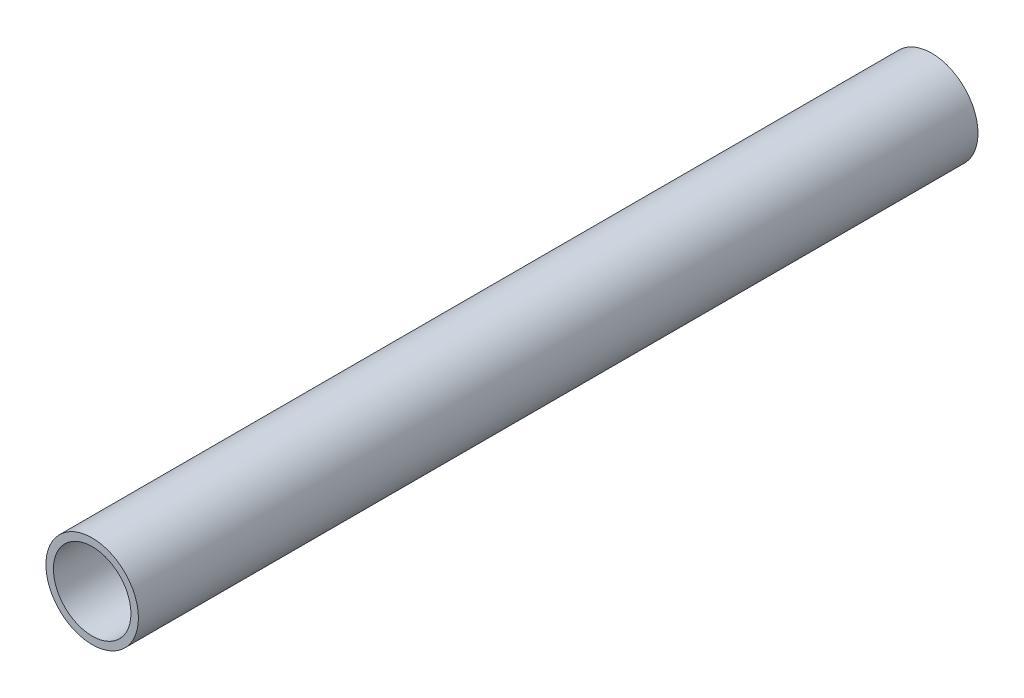
ISO-10303-21;
HEADER;
FILE_DESCRIPTION(('STEP AP214'),'2;1');
FILE_NAME('part.step','',(''),(''),'','','');
FILE_SCHEMA(('AUTOMOTIVE_DESIGN { 1 0 10303 214 1 1 1 1 }'));
ENDSEC;
DATA;
#1=APPLICATION_CONTEXT('core data for automotive mechanical design processes');
#2=APPLICATION_PROTOCOL_DEFINITION('international standard','automotive_design',2000,#1);
#3=PRODUCT_CONTEXT('',#1,'mechanical');
#4=PRODUCT('Part','Part','',(#3));
#5=PRODUCT_RELATED_PRODUCT_CATEGORY('part','',(#4));
#6=PRODUCT_DEFINITION_FORMATION('','',#4);
#7=PRODUCT_DEFINITION_CONTEXT('part definition',#1,'design');
#8=PRODUCT_DEFINITION('design','',#6,#7);
#9=PRODUCT_DEFINITION_SHAPE('','',#8);
#10=(LENGTH_UNIT() NAMED_UNIT(*) SI_UNIT(.MILLI.,.METRE.));
#11=(NAMED_UNIT(*) PLANE_ANGLE_UNIT() SI_UNIT($,.RADIAN.));
#12=(NAMED_UNIT(*) SI_UNIT($,.STERADIAN.) SOLID_ANGLE_UNIT());
#13=UNCERTAINTY_MEASURE_WITH_UNIT(LENGTH_MEASURE(1.E-05),#10,'distance_accuracy_value','');
#14=(GEOMETRIC_REPRESENTATION_CONTEXT(3) GLOBAL_UNCERTAINTY_ASSIGNED_CONTEXT((#13)) GLOBAL_UNIT_ASSIGNED_CONTEXT((#10,
#11,#12)) REPRESENTATION_CONTEXT('',''));
#15=CARTESIAN_POINT('',(0.,0.,0.));
#16=DIRECTION('',(0.,0.,1.));
#17=DIRECTION('',(1.,0.,0.));
#18=AXIS2_PLACEMENT_3D('',#15,#16,#17);
#19=CARTESIAN_POINT('',(0.,0.,550.));
#20=DIRECTION('',(0.,0.,1.));
#21=DIRECTION('',(1.,0.,0.));
#22=AXIS2_PLACEMENT_3D('',#19,#20,#21);
#23=PLANE('',#22);
#24=CARTESIAN_POINT('',(0.,0.,550.));
#25=DIRECTION('',(0.,0.,1.));
#26=DIRECTION('',(1.,0.,0.));
#27=AXIS2_PLACEMENT_3D('',#24,#25,#26);
#28=CIRCLE('',#27,30.3);
#29=CARTESIAN_POINT('',(30.3,0.,550.));
#30=VERTEX_POINT('',#29);
#31=EDGE_CURVE('E10',#30,#30,#28,.T.);
#32=ORIENTED_EDGE('',*,*,#31,.T.);
#33=EDGE_LOOP('',(#32));
#34=FACE_BOUND('',#33,.T.);
#35=CARTESIAN_POINT('',(0.,0.,550.));
#36=DIRECTION('',(0.,0.,1.));
#37=DIRECTION('',(1.,0.,0.));
#38=AXIS2_PLACEMENT_3D('',#35,#36,#37);
#39=CIRCLE('',#38,25.4);
#40=CARTESIAN_POINT('',(25.4,0.,550.));
#41=VERTEX_POINT('',#40);
#42=EDGE_CURVE('E54',#41,#41,#39,.T.);
#43=ORIENTED_EDGE('',*,*,#42,.F.);
#44=EDGE_LOOP('',(#43));
#45=FACE_BOUND('',#44,.T.);
#46=ADVANCED_FACE('F41',(#34,#45),#23,.T.);
#47=CARTESIAN_POINT('',(0.,0.,0.));
#48=DIRECTION('',(0.,0.,1.));
#49=DIRECTION('',(1.,0.,0.));
#50=AXIS2_PLACEMENT_3D('',#47,#48,#49);
#51=PLANE('',#50);
#52=CARTESIAN_POINT('',(0.,0.,0.));
#53=DIRECTION('',(0.,0.,1.));
#54=DIRECTION('',(1.,0.,0.));
#55=AXIS2_PLACEMENT_3D('',#52,#53,#54);
#56=CIRCLE('',#55,30.3);
#57=CARTESIAN_POINT('',(30.3,0.,0.));
#58=VERTEX_POINT('',#57);
#59=EDGE_CURVE('E45',#58,#58,#56,.T.);
#60=ORIENTED_EDGE('',*,*,#59,.F.);
#61=EDGE_LOOP('',(#60));
#62=FACE_BOUND('',#61,.T.);
#63=CARTESIAN_POINT('',(0.,0.,0.));
#64=DIRECTION('',(0.,0.,1.));
#65=DIRECTION('',(1.,0.,0.));
#66=AXIS2_PLACEMENT_3D('',#63,#64,#65);
#67=CIRCLE('',#66,25.4);
#68=CARTESIAN_POINT('',(25.4,0.,0.));
#69=VERTEX_POINT('',#68);
#70=EDGE_CURVE('E56',#69,#69,#67,.T.);
#71=ORIENTED_EDGE('',*,*,#70,.T.);
#72=EDGE_LOOP('',(#71));
#73=FACE_BOUND('',#72,.T.);
#74=ADVANCED_FACE('F68',(#62,#73),#51,.F.);
#75=CARTESIAN_POINT('',(0.,0.,550.));
#76=DIRECTION('',(0.,0.,-1.));
#77=DIRECTION('',(-1.,0.,0.));
#78=AXIS2_PLACEMENT_3D('',#75,#76,#77);
#79=CYLINDRICAL_SURFACE('',#78,30.3);
#80=ORIENTED_EDGE('',*,*,#31,.F.);
#81=EDGE_LOOP('',(#80));
#82=FACE_BOUND('',#81,.T.);
#83=ORIENTED_EDGE('',*,*,#59,.T.);
#84=EDGE_LOOP('',(#83));
#85=FACE_BOUND('',#84,.T.);
#86=ADVANCED_FACE('F43',(#82,#85),#79,.T.);
#87=CARTESIAN_POINT('',(0.,0.,550.));
#88=DIRECTION('',(0.,0.,-1.));
#89=DIRECTION('',(-1.,0.,0.));
#90=AXIS2_PLACEMENT_3D('',#87,#88,#89);
#91=CYLINDRICAL_SURFACE('',#90,25.4);
#92=ORIENTED_EDGE('',*,*,#42,.T.);
#93=EDGE_LOOP('',(#92));
#94=FACE_BOUND('',#93,.T.);
#95=ORIENTED_EDGE('',*,*,#70,.F.);
#96=EDGE_LOOP('',(#95));
#97=FACE_BOUND('',#96,.T.);
#98=ADVANCED_FACE('F64',(#94,#97),#91,.F.);
#99=CLOSED_SHELL('',(#46,#74,#86,#98));
#100=MANIFOLD_SOLID_BREP('B2',#99);
#101=ADVANCED_BREP_SHAPE_REPRESENTATION('',(#18,#100),#14);
#102=SHAPE_DEFINITION_REPRESENTATION(#9,#101);
ENDSEC;
END-ISO-10303-21;
